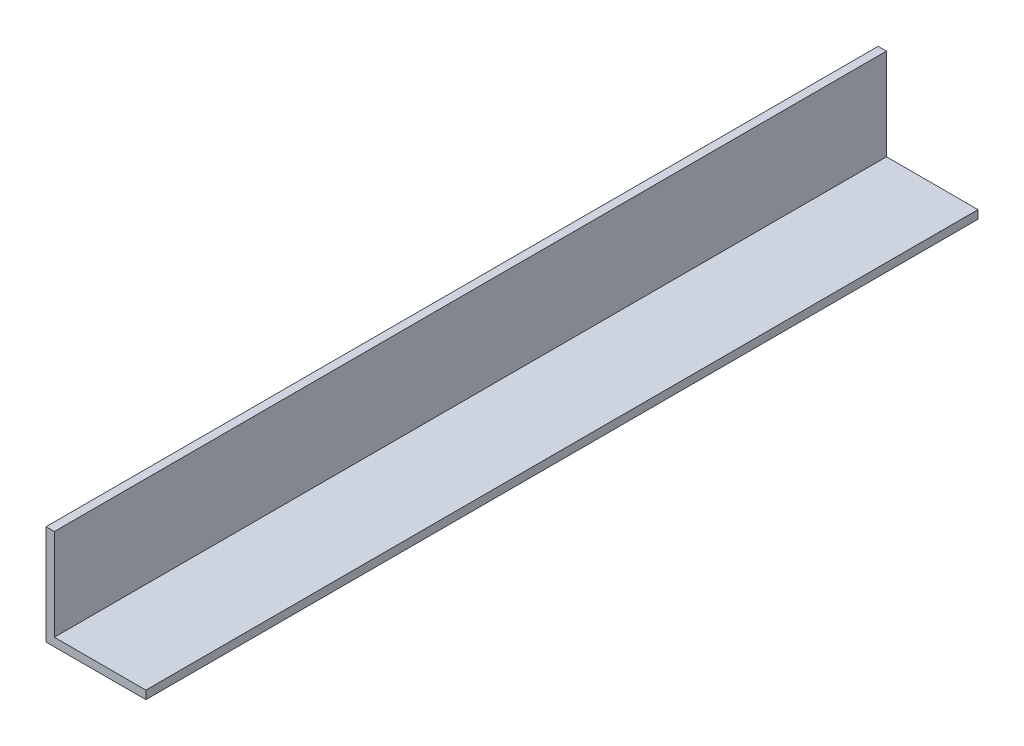
ISO-10303-21;
HEADER;
FILE_DESCRIPTION(('STEP AP214'),'2;1');
FILE_NAME('part.step','',(''),(''),'','','');
FILE_SCHEMA(('AUTOMOTIVE_DESIGN { 1 0 10303 214 1 1 1 1 }'));
ENDSEC;
DATA;
#1=APPLICATION_CONTEXT('core data for automotive mechanical design processes');
#2=APPLICATION_PROTOCOL_DEFINITION('international standard','automotive_design',2000,#1);
#3=PRODUCT_CONTEXT('',#1,'mechanical');
#4=PRODUCT('Part','Part','',(#3));
#5=PRODUCT_RELATED_PRODUCT_CATEGORY('part','',(#4));
#6=PRODUCT_DEFINITION_FORMATION('','',#4);
#7=PRODUCT_DEFINITION_CONTEXT('part definition',#1,'design');
#8=PRODUCT_DEFINITION('design','',#6,#7);
#9=PRODUCT_DEFINITION_SHAPE('','',#8);
#10=(LENGTH_UNIT() NAMED_UNIT(*) SI_UNIT(.MILLI.,.METRE.));
#11=(NAMED_UNIT(*) PLANE_ANGLE_UNIT() SI_UNIT($,.RADIAN.));
#12=(NAMED_UNIT(*) SI_UNIT($,.STERADIAN.) SOLID_ANGLE_UNIT());
#13=UNCERTAINTY_MEASURE_WITH_UNIT(LENGTH_MEASURE(1.E-05),#10,'distance_accuracy_value','');
#14=(GEOMETRIC_REPRESENTATION_CONTEXT(3) GLOBAL_UNCERTAINTY_ASSIGNED_CONTEXT((#13)) GLOBAL_UNIT_ASSIGNED_CONTEXT((#10,
#11,#12)) REPRESENTATION_CONTEXT('',''));
#15=CARTESIAN_POINT('',(0.,0.,0.));
#16=DIRECTION('',(0.,0.,1.));
#17=DIRECTION('',(1.,0.,0.));
#18=AXIS2_PLACEMENT_3D('',#15,#16,#17);
#19=CARTESIAN_POINT('',(-2.5,3.,50.));
#20=DIRECTION('',(0.,-1.,0.));
#21=DIRECTION('',(1.,0.,0.));
#22=AXIS2_PLACEMENT_3D('',#19,#20,#21);
#23=PLANE('',#22);
#24=DIRECTION('',(-1.,0.,0.));
#25=VECTOR('',#24,1.);
#26=CARTESIAN_POINT('',(-2.5,3.,0.));
#27=LINE('',#26,#25);
#28=CARTESIAN_POINT('',(-2.5,3.,0.));
#29=VERTEX_POINT('',#28);
#30=CARTESIAN_POINT('',(-3.,3.,0.));
#31=VERTEX_POINT('',#30);
#32=EDGE_CURVE('E117',#29,#31,#27,.T.);
#33=ORIENTED_EDGE('',*,*,#32,.T.);
#34=DIRECTION('',(0.,0.,-1.));
#35=VECTOR('',#34,1.);
#36=CARTESIAN_POINT('',(-3.,3.,50.));
#37=LINE('',#36,#35);
#38=CARTESIAN_POINT('',(-3.,3.,50.));
#39=VERTEX_POINT('',#38);
#40=EDGE_CURVE('E11',#39,#31,#37,.T.);
#41=ORIENTED_EDGE('',*,*,#40,.F.);
#42=DIRECTION('',(-1.,0.,0.));
#43=VECTOR('',#42,1.);
#44=CARTESIAN_POINT('',(-2.5,3.,50.));
#45=LINE('',#44,#43);
#46=CARTESIAN_POINT('',(-2.5,3.,50.));
#47=VERTEX_POINT('',#46);
#48=EDGE_CURVE('E127',#47,#39,#45,.T.);
#49=ORIENTED_EDGE('',*,*,#48,.F.);
#50=DIRECTION('',(0.,0.,-1.));
#51=VECTOR('',#50,1.);
#52=CARTESIAN_POINT('',(-2.5,3.,50.));
#53=LINE('',#52,#51);
#54=EDGE_CURVE('E113',#47,#29,#53,.T.);
#55=ORIENTED_EDGE('',*,*,#54,.T.);
#56=EDGE_LOOP('',(#33,#41,#49,#55));
#57=FACE_BOUND('',#56,.T.);
#58=ADVANCED_FACE('F33',(#57),#23,.F.);
#59=CARTESIAN_POINT('',(-3.,3.,50.));
#60=DIRECTION('',(1.,0.,0.));
#61=DIRECTION('',(0.,0.,-1.));
#62=AXIS2_PLACEMENT_3D('',#59,#60,#61);
#63=PLANE('',#62);
#64=DIRECTION('',(0.,-1.,0.));
#65=VECTOR('',#64,1.);
#66=CARTESIAN_POINT('',(-3.,3.,0.));
#67=LINE('',#66,#65);
#68=CARTESIAN_POINT('',(-3.,-3.,0.));
#69=VERTEX_POINT('',#68);
#70=EDGE_CURVE('E120',#31,#69,#67,.T.);
#71=ORIENTED_EDGE('',*,*,#70,.T.);
#72=DIRECTION('',(0.,0.,-1.));
#73=VECTOR('',#72,1.);
#74=CARTESIAN_POINT('',(-3.,-3.,50.));
#75=LINE('',#74,#73);
#76=CARTESIAN_POINT('',(-3.,-3.,50.));
#77=VERTEX_POINT('',#76);
#78=EDGE_CURVE('E41',#77,#69,#75,.T.);
#79=ORIENTED_EDGE('',*,*,#78,.F.);
#80=DIRECTION('',(0.,-1.,0.));
#81=VECTOR('',#80,1.);
#82=CARTESIAN_POINT('',(-3.,3.,50.));
#83=LINE('',#82,#81);
#84=EDGE_CURVE('E86',#39,#77,#83,.T.);
#85=ORIENTED_EDGE('',*,*,#84,.F.);
#86=ORIENTED_EDGE('',*,*,#40,.T.);
#87=EDGE_LOOP('',(#71,#79,#85,#86));
#88=FACE_BOUND('',#87,.T.);
#89=ADVANCED_FACE('F151',(#88),#63,.F.);
#90=CARTESIAN_POINT('',(-3.,-3.,50.));
#91=DIRECTION('',(0.,1.,0.));
#92=DIRECTION('',(-1.,0.,0.));
#93=AXIS2_PLACEMENT_3D('',#90,#91,#92);
#94=PLANE('',#93);
#95=DIRECTION('',(1.,0.,0.));
#96=VECTOR('',#95,1.);
#97=CARTESIAN_POINT('',(-3.,-3.,0.));
#98=LINE('',#97,#96);
#99=CARTESIAN_POINT('',(3.,-3.,0.));
#100=VERTEX_POINT('',#99);
#101=EDGE_CURVE('E122',#69,#100,#98,.T.);
#102=ORIENTED_EDGE('',*,*,#101,.T.);
#103=DIRECTION('',(0.,0.,-1.));
#104=VECTOR('',#103,1.);
#105=CARTESIAN_POINT('',(3.,-3.,50.));
#106=LINE('',#105,#104);
#107=CARTESIAN_POINT('',(3.,-3.,50.));
#108=VERTEX_POINT('',#107);
#109=EDGE_CURVE('E108',#108,#100,#106,.T.);
#110=ORIENTED_EDGE('',*,*,#109,.F.);
#111=DIRECTION('',(1.,0.,0.));
#112=VECTOR('',#111,1.);
#113=CARTESIAN_POINT('',(-3.,-3.,50.));
#114=LINE('',#113,#112);
#115=EDGE_CURVE('E99',#77,#108,#114,.T.);
#116=ORIENTED_EDGE('',*,*,#115,.F.);
#117=ORIENTED_EDGE('',*,*,#78,.T.);
#118=EDGE_LOOP('',(#102,#110,#116,#117));
#119=FACE_BOUND('',#118,.T.);
#120=ADVANCED_FACE('F133',(#119),#94,.F.);
#121=CARTESIAN_POINT('',(3.,-3.,50.));
#122=DIRECTION('',(-1.,0.,0.));
#123=DIRECTION('',(0.,-1.,0.));
#124=AXIS2_PLACEMENT_3D('',#121,#122,#123);
#125=PLANE('',#124);
#126=DIRECTION('',(0.,1.,0.));
#127=VECTOR('',#126,1.);
#128=CARTESIAN_POINT('',(3.,-3.,0.));
#129=LINE('',#128,#127);
#130=CARTESIAN_POINT('',(3.,-2.5,0.));
#131=VERTEX_POINT('',#130);
#132=EDGE_CURVE('E107',#100,#131,#129,.T.);
#133=ORIENTED_EDGE('',*,*,#132,.T.);
#134=DIRECTION('',(0.,0.,-1.));
#135=VECTOR('',#134,1.);
#136=CARTESIAN_POINT('',(3.,-2.5,50.));
#137=LINE('',#136,#135);
#138=CARTESIAN_POINT('',(3.,-2.5,50.));
#139=VERTEX_POINT('',#138);
#140=EDGE_CURVE('E104',#139,#131,#137,.T.);
#141=ORIENTED_EDGE('',*,*,#140,.F.);
#142=DIRECTION('',(0.,1.,0.));
#143=VECTOR('',#142,1.);
#144=CARTESIAN_POINT('',(3.,-3.,50.));
#145=LINE('',#144,#143);
#146=EDGE_CURVE('E93',#108,#139,#145,.T.);
#147=ORIENTED_EDGE('',*,*,#146,.F.);
#148=ORIENTED_EDGE('',*,*,#109,.T.);
#149=EDGE_LOOP('',(#133,#141,#147,#148));
#150=FACE_BOUND('',#149,.T.);
#151=ADVANCED_FACE('F105',(#150),#125,.F.);
#152=CARTESIAN_POINT('',(3.,-2.5,50.));
#153=DIRECTION('',(0.,-1.,0.));
#154=DIRECTION('',(1.,0.,0.));
#155=AXIS2_PLACEMENT_3D('',#152,#153,#154);
#156=PLANE('',#155);
#157=DIRECTION('',(-1.,0.,0.));
#158=VECTOR('',#157,1.);
#159=CARTESIAN_POINT('',(3.,-2.5,0.));
#160=LINE('',#159,#158);
#161=CARTESIAN_POINT('',(-2.5,-2.5,0.));
#162=VERTEX_POINT('',#161);
#163=EDGE_CURVE('E72',#131,#162,#160,.T.);
#164=ORIENTED_EDGE('',*,*,#163,.T.);
#165=DIRECTION('',(0.,0.,-1.));
#166=VECTOR('',#165,1.);
#167=CARTESIAN_POINT('',(-2.5,-2.5,50.));
#168=LINE('',#167,#166);
#169=CARTESIAN_POINT('',(-2.5,-2.5,50.));
#170=VERTEX_POINT('',#169);
#171=EDGE_CURVE('E109',#170,#162,#168,.T.);
#172=ORIENTED_EDGE('',*,*,#171,.F.);
#173=DIRECTION('',(-1.,0.,0.));
#174=VECTOR('',#173,1.);
#175=CARTESIAN_POINT('',(3.,-2.5,50.));
#176=LINE('',#175,#174);
#177=EDGE_CURVE('E97',#139,#170,#176,.T.);
#178=ORIENTED_EDGE('',*,*,#177,.F.);
#179=ORIENTED_EDGE('',*,*,#140,.T.);
#180=EDGE_LOOP('',(#164,#172,#178,#179));
#181=FACE_BOUND('',#180,.T.);
#182=ADVANCED_FACE('F111',(#181),#156,.F.);
#183=CARTESIAN_POINT('',(-2.5,-2.5,50.));
#184=DIRECTION('',(-1.,0.,0.));
#185=DIRECTION('',(0.,-1.,0.));
#186=AXIS2_PLACEMENT_3D('',#183,#184,#185);
#187=PLANE('',#186);
#188=DIRECTION('',(0.,1.,0.));
#189=VECTOR('',#188,1.);
#190=CARTESIAN_POINT('',(-2.5,-2.5,0.));
#191=LINE('',#190,#189);
#192=EDGE_CURVE('E78',#162,#29,#191,.T.);
#193=ORIENTED_EDGE('',*,*,#192,.T.);
#194=ORIENTED_EDGE('',*,*,#54,.F.);
#195=DIRECTION('',(0.,1.,0.));
#196=VECTOR('',#195,1.);
#197=CARTESIAN_POINT('',(-2.5,-2.5,50.));
#198=LINE('',#197,#196);
#199=EDGE_CURVE('E49',#170,#47,#198,.T.);
#200=ORIENTED_EDGE('',*,*,#199,.F.);
#201=ORIENTED_EDGE('',*,*,#171,.T.);
#202=EDGE_LOOP('',(#193,#194,#200,#201));
#203=FACE_BOUND('',#202,.T.);
#204=ADVANCED_FACE('F140',(#203),#187,.F.);
#205=CARTESIAN_POINT('',(0.,0.,50.));
#206=DIRECTION('',(0.,0.,1.));
#207=DIRECTION('',(1.,0.,0.));
#208=AXIS2_PLACEMENT_3D('',#205,#206,#207);
#209=PLANE('',#208);
#210=ORIENTED_EDGE('',*,*,#48,.T.);
#211=ORIENTED_EDGE('',*,*,#84,.T.);
#212=ORIENTED_EDGE('',*,*,#115,.T.);
#213=ORIENTED_EDGE('',*,*,#146,.T.);
#214=ORIENTED_EDGE('',*,*,#177,.T.);
#215=ORIENTED_EDGE('',*,*,#199,.T.);
#216=EDGE_LOOP('',(#210,#211,#212,#213,#214,#215));
#217=FACE_BOUND('',#216,.T.);
#218=ADVANCED_FACE('F95',(#217),#209,.T.);
#219=CARTESIAN_POINT('',(0.,0.,0.));
#220=DIRECTION('',(0.,0.,1.));
#221=DIRECTION('',(1.,0.,0.));
#222=AXIS2_PLACEMENT_3D('',#219,#220,#221);
#223=PLANE('',#222);
#224=ORIENTED_EDGE('',*,*,#32,.F.);
#225=ORIENTED_EDGE('',*,*,#192,.F.);
#226=ORIENTED_EDGE('',*,*,#163,.F.);
#227=ORIENTED_EDGE('',*,*,#132,.F.);
#228=ORIENTED_EDGE('',*,*,#101,.F.);
#229=ORIENTED_EDGE('',*,*,#70,.F.);
#230=EDGE_LOOP('',(#224,#225,#226,#227,#228,#229));
#231=FACE_BOUND('',#230,.T.);
#232=ADVANCED_FACE('F136',(#231),#223,.F.);
#233=CLOSED_SHELL('',(#58,#89,#120,#151,#182,#204,#218,#232));
#234=MANIFOLD_SOLID_BREP('B2',#233);
#235=ADVANCED_BREP_SHAPE_REPRESENTATION('',(#18,#234),#14);
#236=SHAPE_DEFINITION_REPRESENTATION(#9,#235);
ENDSEC;
END-ISO-10303-21;
